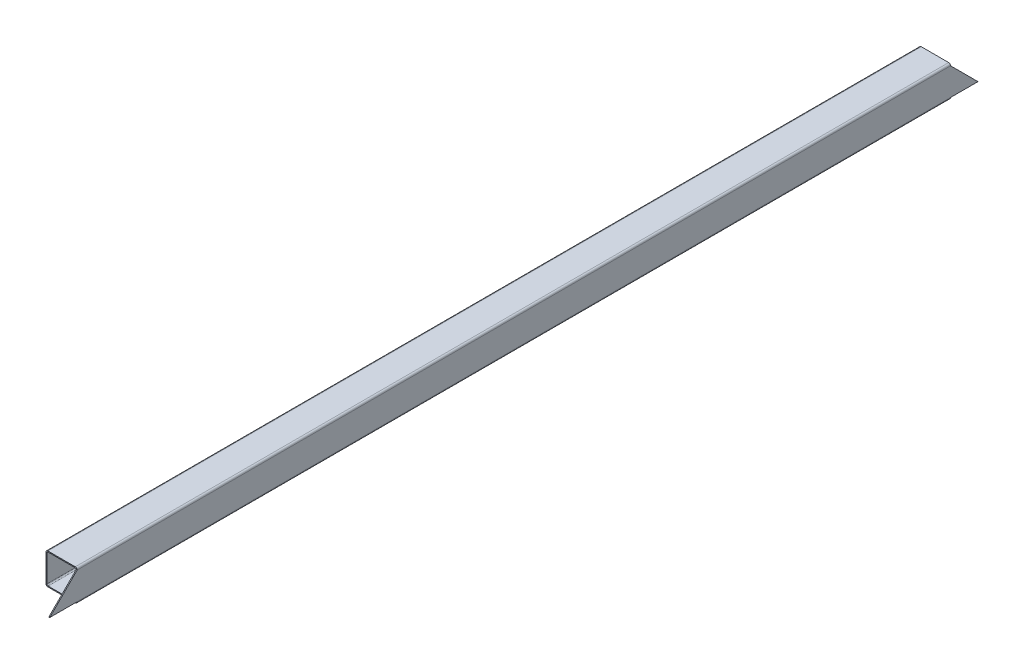
ISO-10303-21;
HEADER;
FILE_DESCRIPTION(('STEP AP214'),'2;1');
FILE_NAME('part.step','',(''),(''),'','','');
FILE_SCHEMA(('AUTOMOTIVE_DESIGN { 1 0 10303 214 1 1 1 1 }'));
ENDSEC;
DATA;
#1=APPLICATION_CONTEXT('core data for automotive mechanical design processes');
#2=APPLICATION_PROTOCOL_DEFINITION('international standard','automotive_design',2000,#1);
#3=PRODUCT_CONTEXT('',#1,'mechanical');
#4=PRODUCT('Part','Part','',(#3));
#5=PRODUCT_RELATED_PRODUCT_CATEGORY('part','',(#4));
#6=PRODUCT_DEFINITION_FORMATION('','',#4);
#7=PRODUCT_DEFINITION_CONTEXT('part definition',#1,'design');
#8=PRODUCT_DEFINITION('design','',#6,#7);
#9=PRODUCT_DEFINITION_SHAPE('','',#8);
#10=(LENGTH_UNIT() NAMED_UNIT(*) SI_UNIT(.MILLI.,.METRE.));
#11=(NAMED_UNIT(*) PLANE_ANGLE_UNIT() SI_UNIT($,.RADIAN.));
#12=(NAMED_UNIT(*) SI_UNIT($,.STERADIAN.) SOLID_ANGLE_UNIT());
#13=UNCERTAINTY_MEASURE_WITH_UNIT(LENGTH_MEASURE(1.E-05),#10,'distance_accuracy_value','');
#14=(GEOMETRIC_REPRESENTATION_CONTEXT(3) GLOBAL_UNCERTAINTY_ASSIGNED_CONTEXT((#13)) GLOBAL_UNIT_ASSIGNED_CONTEXT((#10,
#11,#12)) REPRESENTATION_CONTEXT('',''));
#15=CARTESIAN_POINT('',(0.,0.,0.));
#16=DIRECTION('',(0.,0.,1.));
#17=DIRECTION('',(1.,0.,0.));
#18=AXIS2_PLACEMENT_3D('',#15,#16,#17);
#19=CARTESIAN_POINT('',(-44.0000000000005,-43.9999999999965,-2800.));
#20=DIRECTION('',(0.,0.,1.));
#21=DIRECTION('',(1.,0.,0.));
#22=AXIS2_PLACEMENT_3D('',#19,#20,#21);
#23=PLANE('',#22);
#24=DIRECTION('',(0.,1.,0.));
#25=VECTOR('',#24,1.);
#26=CARTESIAN_POINT('',(46.9999999999991,-43.9999999999965,-2800.));
#27=LINE('',#26,#25);
#28=CARTESIAN_POINT('',(46.9999999999991,-43.9999999999965,-2800.));
#29=VERTEX_POINT('',#28);
#30=CARTESIAN_POINT('',(46.9999999999991,-42.9999999999966,-2800.));
#31=VERTEX_POINT('',#30);
#32=EDGE_CURVE('E47',#29,#31,#27,.T.);
#33=ORIENTED_EDGE('',*,*,#32,.F.);
#34=DIRECTION('',(1.,0.,0.));
#35=VECTOR('',#34,1.);
#36=CARTESIAN_POINT('',(-77.4507934888333,-43.9999999999965,-2800.));
#37=LINE('',#36,#35);
#38=CARTESIAN_POINT('',(49.9999999999989,-43.9999999999965,-2800.));
#39=VERTEX_POINT('',#38);
#40=EDGE_CURVE('E200',#29,#39,#37,.T.);
#41=ORIENTED_EDGE('',*,*,#40,.T.);
#42=CARTESIAN_POINT('',(43.9999999999987,-43.9999999999965,-2800.));
#43=DIRECTION('',(0.,0.,1.));
#44=DIRECTION('',(1.,0.,0.));
#45=AXIS2_PLACEMENT_3D('',#42,#43,#44);
#46=CIRCLE('',#45,6.00000000000014);
#47=CARTESIAN_POINT('',(43.9999999999987,-49.9999999999967,-2800.));
#48=VERTEX_POINT('',#47);
#49=EDGE_CURVE('E291',#48,#39,#46,.T.);
#50=ORIENTED_EDGE('',*,*,#49,.F.);
#51=DIRECTION('',(1.,0.,0.));
#52=VECTOR('',#51,1.);
#53=CARTESIAN_POINT('',(-44.0000000000005,-49.9999999999966,-2800.));
#54=LINE('',#53,#52);
#55=CARTESIAN_POINT('',(-44.0000000000005,-49.9999999999966,-2800.));
#56=VERTEX_POINT('',#55);
#57=EDGE_CURVE('E287',#56,#48,#54,.T.);
#58=ORIENTED_EDGE('',*,*,#57,.F.);
#59=CARTESIAN_POINT('',(-44.0000000000005,-43.9999999999965,-2800.));
#60=DIRECTION('',(0.,0.,1.));
#61=DIRECTION('',(1.,0.,0.));
#62=AXIS2_PLACEMENT_3D('',#59,#60,#61);
#63=CIRCLE('',#62,6.00000000000014);
#64=CARTESIAN_POINT('',(-50.0000000000007,-43.9999999999965,-2800.));
#65=VERTEX_POINT('',#64);
#66=EDGE_CURVE('E284',#65,#56,#63,.T.);
#67=ORIENTED_EDGE('',*,*,#66,.F.);
#68=DIRECTION('',(0.,-1.,0.));
#69=VECTOR('',#68,1.);
#70=CARTESIAN_POINT('',(-50.0000000000007,44.0000000000034,-2800.));
#71=LINE('',#70,#69);
#72=CARTESIAN_POINT('',(-50.0000000000007,44.0000000000034,-2800.));
#73=VERTEX_POINT('',#72);
#74=EDGE_CURVE('E302',#73,#65,#71,.T.);
#75=ORIENTED_EDGE('',*,*,#74,.F.);
#76=CARTESIAN_POINT('',(-44.0000000000005,44.0000000000034,-2800.));
#77=DIRECTION('',(0.,0.,1.));
#78=DIRECTION('',(1.,0.,0.));
#79=AXIS2_PLACEMENT_3D('',#76,#77,#78);
#80=CIRCLE('',#79,6.00000000000014);
#81=CARTESIAN_POINT('',(-44.0000000000005,50.0000000000036,-2800.));
#82=VERTEX_POINT('',#81);
#83=EDGE_CURVE('E299',#82,#73,#80,.T.);
#84=ORIENTED_EDGE('',*,*,#83,.F.);
#85=DIRECTION('',(-1.,0.,0.));
#86=VECTOR('',#85,1.);
#87=CARTESIAN_POINT('',(-44.0000000000005,50.0000000000035,-2800.));
#88=LINE('',#87,#86);
#89=CARTESIAN_POINT('',(43.9999999999987,50.0000000000035,-2800.));
#90=VERTEX_POINT('',#89);
#91=EDGE_CURVE('E296',#90,#82,#88,.T.);
#92=ORIENTED_EDGE('',*,*,#91,.F.);
#93=CARTESIAN_POINT('',(43.9999999999987,44.0000000000034,-2800.));
#94=DIRECTION('',(0.,0.,1.));
#95=DIRECTION('',(-1.,0.,0.));
#96=AXIS2_PLACEMENT_3D('',#93,#94,#95);
#97=CIRCLE('',#96,6.00000000000014);
#98=CARTESIAN_POINT('',(49.9999999999989,44.0000000000034,-2800.));
#99=VERTEX_POINT('',#98);
#100=EDGE_CURVE('E293',#99,#90,#97,.T.);
#101=ORIENTED_EDGE('',*,*,#100,.F.);
#102=DIRECTION('',(1.,0.,0.));
#103=VECTOR('',#102,1.);
#104=CARTESIAN_POINT('',(-77.4507934888333,44.0000000000034,-2800.));
#105=LINE('',#104,#103);
#106=CARTESIAN_POINT('',(46.9999999999991,44.0000000000034,-2800.));
#107=VERTEX_POINT('',#106);
#108=EDGE_CURVE('E60',#107,#99,#105,.T.);
#109=ORIENTED_EDGE('',*,*,#108,.F.);
#110=CARTESIAN_POINT('',(46.9999999999991,43.0000000000035,-2800.));
#111=VERTEX_POINT('',#110);
#112=EDGE_CURVE('E11',#111,#107,#27,.T.);
#113=ORIENTED_EDGE('',*,*,#112,.F.);
#114=CARTESIAN_POINT('',(42.9999999999991,43.0000000000035,-2800.));
#115=DIRECTION('',(0.,0.,1.));
#116=DIRECTION('',(-1.,0.,0.));
#117=AXIS2_PLACEMENT_3D('',#114,#115,#116);
#118=CIRCLE('',#117,4.);
#119=CARTESIAN_POINT('',(42.9999999999991,47.0000000000035,-2800.));
#120=VERTEX_POINT('',#119);
#121=EDGE_CURVE('E235',#111,#120,#118,.T.);
#122=ORIENTED_EDGE('',*,*,#121,.T.);
#123=DIRECTION('',(-1.,0.,0.));
#124=VECTOR('',#123,1.);
#125=CARTESIAN_POINT('',(-43.0000000000009,47.0000000000035,-2800.));
#126=LINE('',#125,#124);
#127=CARTESIAN_POINT('',(-43.0000000000009,47.0000000000035,-2800.));
#128=VERTEX_POINT('',#127);
#129=EDGE_CURVE('E238',#120,#128,#126,.T.);
#130=ORIENTED_EDGE('',*,*,#129,.T.);
#131=CARTESIAN_POINT('',(-43.0000000000009,43.0000000000035,-2800.));
#132=DIRECTION('',(0.,0.,1.));
#133=DIRECTION('',(1.,0.,0.));
#134=AXIS2_PLACEMENT_3D('',#131,#132,#133);
#135=CIRCLE('',#134,4.);
#136=CARTESIAN_POINT('',(-47.0000000000009,43.0000000000035,-2800.));
#137=VERTEX_POINT('',#136);
#138=EDGE_CURVE('E241',#128,#137,#135,.T.);
#139=ORIENTED_EDGE('',*,*,#138,.T.);
#140=DIRECTION('',(0.,-1.,0.));
#141=VECTOR('',#140,1.);
#142=CARTESIAN_POINT('',(-47.0000000000009,43.0000000000035,-2800.));
#143=LINE('',#142,#141);
#144=CARTESIAN_POINT('',(-47.0000000000009,-42.9999999999966,-2800.));
#145=VERTEX_POINT('',#144);
#146=EDGE_CURVE('E244',#137,#145,#143,.T.);
#147=ORIENTED_EDGE('',*,*,#146,.T.);
#148=CARTESIAN_POINT('',(-43.0000000000009,-42.9999999999966,-2800.));
#149=DIRECTION('',(0.,0.,1.));
#150=DIRECTION('',(1.,0.,0.));
#151=AXIS2_PLACEMENT_3D('',#148,#149,#150);
#152=CIRCLE('',#151,4.);
#153=CARTESIAN_POINT('',(-43.0000000000009,-46.9999999999966,-2800.));
#154=VERTEX_POINT('',#153);
#155=EDGE_CURVE('E226',#145,#154,#152,.T.);
#156=ORIENTED_EDGE('',*,*,#155,.T.);
#157=DIRECTION('',(1.,0.,0.));
#158=VECTOR('',#157,1.);
#159=CARTESIAN_POINT('',(-43.0000000000009,-46.9999999999966,-2800.));
#160=LINE('',#159,#158);
#161=CARTESIAN_POINT('',(42.9999999999991,-46.9999999999966,-2800.));
#162=VERTEX_POINT('',#161);
#163=EDGE_CURVE('E229',#154,#162,#160,.T.);
#164=ORIENTED_EDGE('',*,*,#163,.T.);
#165=CARTESIAN_POINT('',(42.9999999999991,-42.9999999999966,-2800.));
#166=DIRECTION('',(0.,0.,1.));
#167=DIRECTION('',(1.,0.,0.));
#168=AXIS2_PLACEMENT_3D('',#165,#166,#167);
#169=CIRCLE('',#168,4.);
#170=EDGE_CURVE('E233',#162,#31,#169,.T.);
#171=ORIENTED_EDGE('',*,*,#170,.T.);
#172=EDGE_LOOP('',(#33,#41,#50,#58,#67,#75,#84,#92,#101,#109,#113,#122,#130,#139,#147,#156,#164,#171));
#173=FACE_BOUND('',#172,.T.);
#174=ADVANCED_FACE('F36',(#173),#23,.F.);
#175=CARTESIAN_POINT('',(-44.0000000000005,-43.9999999999965,-2800.));
#176=DIRECTION('',(0.,0.,1.));
#177=DIRECTION('',(1.,0.,0.));
#178=AXIS2_PLACEMENT_3D('',#175,#176,#177);
#179=CYLINDRICAL_SURFACE('',#178,6.00000000000014);
#180=CARTESIAN_POINT('',(-44.0000000000005,-43.9999999999965,0.));
#181=DIRECTION('',(0.,0.,1.));
#182=DIRECTION('',(1.,0.,0.));
#183=AXIS2_PLACEMENT_3D('',#180,#181,#182);
#184=CIRCLE('',#183,6.00000000000014);
#185=CARTESIAN_POINT('',(-50.0000000000007,-43.9999999999965,0.));
#186=VERTEX_POINT('',#185);
#187=CARTESIAN_POINT('',(-44.0000000000005,-49.9999999999966,0.));
#188=VERTEX_POINT('',#187);
#189=EDGE_CURVE('E268',#186,#188,#184,.T.);
#190=ORIENTED_EDGE('',*,*,#189,.F.);
#191=DIRECTION('',(0.,0.,1.));
#192=VECTOR('',#191,1.);
#193=CARTESIAN_POINT('',(-50.0000000000007,-43.9999999999965,-2800.));
#194=LINE('',#193,#192);
#195=EDGE_CURVE('E323',#65,#186,#194,.T.);
#196=ORIENTED_EDGE('',*,*,#195,.F.);
#197=ORIENTED_EDGE('',*,*,#66,.T.);
#198=DIRECTION('',(0.,0.,1.));
#199=VECTOR('',#198,1.);
#200=CARTESIAN_POINT('',(-44.0000000000005,-49.9999999999966,-2800.));
#201=LINE('',#200,#199);
#202=EDGE_CURVE('E40',#56,#188,#201,.T.);
#203=ORIENTED_EDGE('',*,*,#202,.T.);
#204=EDGE_LOOP('',(#190,#196,#197,#203));
#205=FACE_BOUND('',#204,.T.);
#206=ADVANCED_FACE('F38',(#205),#179,.T.);
#207=CARTESIAN_POINT('',(-50.0000000000007,44.0000000000034,-2800.));
#208=DIRECTION('',(-1.,0.,0.));
#209=DIRECTION('',(0.,0.,1.));
#210=AXIS2_PLACEMENT_3D('',#207,#208,#209);
#211=PLANE('',#210);
#212=DIRECTION('',(0.,-1.,0.));
#213=VECTOR('',#212,1.);
#214=CARTESIAN_POINT('',(-50.0000000000007,44.0000000000034,0.));
#215=LINE('',#214,#213);
#216=CARTESIAN_POINT('',(-50.0000000000007,44.0000000000034,0.));
#217=VERTEX_POINT('',#216);
#218=EDGE_CURVE('E288',#217,#186,#215,.T.);
#219=ORIENTED_EDGE('',*,*,#218,.F.);
#220=DIRECTION('',(0.,0.,1.));
#221=VECTOR('',#220,1.);
#222=CARTESIAN_POINT('',(-50.0000000000007,44.0000000000034,-2800.));
#223=LINE('',#222,#221);
#224=EDGE_CURVE('E325',#73,#217,#223,.T.);
#225=ORIENTED_EDGE('',*,*,#224,.F.);
#226=ORIENTED_EDGE('',*,*,#74,.T.);
#227=ORIENTED_EDGE('',*,*,#195,.T.);
#228=EDGE_LOOP('',(#219,#225,#226,#227));
#229=FACE_BOUND('',#228,.T.);
#230=ADVANCED_FACE('F347',(#229),#211,.T.);
#231=CARTESIAN_POINT('',(-44.0000000000005,44.0000000000034,-2800.));
#232=DIRECTION('',(0.,0.,1.));
#233=DIRECTION('',(1.,0.,0.));
#234=AXIS2_PLACEMENT_3D('',#231,#232,#233);
#235=CYLINDRICAL_SURFACE('',#234,6.00000000000014);
#236=CARTESIAN_POINT('',(-44.0000000000005,44.0000000000034,0.));
#237=DIRECTION('',(0.,0.,1.));
#238=DIRECTION('',(1.,0.,0.));
#239=AXIS2_PLACEMENT_3D('',#236,#237,#238);
#240=CIRCLE('',#239,6.00000000000014);
#241=CARTESIAN_POINT('',(-44.0000000000005,50.0000000000036,0.));
#242=VERTEX_POINT('',#241);
#243=EDGE_CURVE('E318',#242,#217,#240,.T.);
#244=ORIENTED_EDGE('',*,*,#243,.F.);
#245=DIRECTION('',(0.,0.,1.));
#246=VECTOR('',#245,1.);
#247=CARTESIAN_POINT('',(-44.0000000000005,50.0000000000036,-2800.));
#248=LINE('',#247,#246);
#249=EDGE_CURVE('E327',#82,#242,#248,.T.);
#250=ORIENTED_EDGE('',*,*,#249,.F.);
#251=ORIENTED_EDGE('',*,*,#83,.T.);
#252=ORIENTED_EDGE('',*,*,#224,.T.);
#253=EDGE_LOOP('',(#244,#250,#251,#252));
#254=FACE_BOUND('',#253,.T.);
#255=ADVANCED_FACE('F414',(#254),#235,.T.);
#256=CARTESIAN_POINT('',(-44.0000000000005,50.0000000000035,-2800.));
#257=DIRECTION('',(0.,1.,0.));
#258=DIRECTION('',(0.,0.,1.));
#259=AXIS2_PLACEMENT_3D('',#256,#257,#258);
#260=PLANE('',#259);
#261=DIRECTION('',(-1.,0.,0.));
#262=VECTOR('',#261,1.);
#263=CARTESIAN_POINT('',(-44.0000000000005,50.0000000000035,0.));
#264=LINE('',#263,#262);
#265=CARTESIAN_POINT('',(43.9999999999987,50.0000000000035,0.));
#266=VERTEX_POINT('',#265);
#267=EDGE_CURVE('E315',#266,#242,#264,.T.);
#268=ORIENTED_EDGE('',*,*,#267,.F.);
#269=DIRECTION('',(0.,0.,1.));
#270=VECTOR('',#269,1.);
#271=CARTESIAN_POINT('',(43.9999999999987,50.0000000000035,-2800.));
#272=LINE('',#271,#270);
#273=EDGE_CURVE('E329',#90,#266,#272,.T.);
#274=ORIENTED_EDGE('',*,*,#273,.F.);
#275=ORIENTED_EDGE('',*,*,#91,.T.);
#276=ORIENTED_EDGE('',*,*,#249,.T.);
#277=EDGE_LOOP('',(#268,#274,#275,#276));
#278=FACE_BOUND('',#277,.T.);
#279=ADVANCED_FACE('F417',(#278),#260,.T.);
#280=CARTESIAN_POINT('',(43.9999999999987,44.0000000000034,-2800.));
#281=DIRECTION('',(0.,0.,1.));
#282=DIRECTION('',(1.,0.,0.));
#283=AXIS2_PLACEMENT_3D('',#280,#281,#282);
#284=CYLINDRICAL_SURFACE('',#283,6.00000000000014);
#285=CARTESIAN_POINT('',(43.9999999999987,44.0000000000034,0.));
#286=DIRECTION('',(0.,0.,1.));
#287=DIRECTION('',(-1.,0.,0.));
#288=AXIS2_PLACEMENT_3D('',#285,#286,#287);
#289=CIRCLE('',#288,6.00000000000014);
#290=CARTESIAN_POINT('',(49.9999999999988,44.0000000000034,0.));
#291=VERTEX_POINT('',#290);
#292=EDGE_CURVE('E312',#291,#266,#289,.T.);
#293=ORIENTED_EDGE('',*,*,#292,.F.);
#294=DIRECTION('',(0.,0.,1.));
#295=VECTOR('',#294,1.);
#296=CARTESIAN_POINT('',(49.9999999999988,44.0000000000034,-2800.));
#297=LINE('',#296,#295);
#298=EDGE_CURVE('E331',#99,#291,#297,.T.);
#299=ORIENTED_EDGE('',*,*,#298,.F.);
#300=ORIENTED_EDGE('',*,*,#100,.T.);
#301=ORIENTED_EDGE('',*,*,#273,.T.);
#302=EDGE_LOOP('',(#293,#299,#300,#301));
#303=FACE_BOUND('',#302,.T.);
#304=ADVANCED_FACE('F421',(#303),#284,.T.);
#305=CARTESIAN_POINT('',(49.9999999999989,44.0000000000034,-2800.));
#306=DIRECTION('',(1.,0.,0.));
#307=DIRECTION('',(0.,0.,-1.));
#308=AXIS2_PLACEMENT_3D('',#305,#306,#307);
#309=PLANE('',#308);
#310=ORIENTED_EDGE('',*,*,#298,.T.);
#311=DIRECTION('',(0.,-0.707106781186548,0.707106781186547));
#312=VECTOR('',#311,1.);
#313=CARTESIAN_POINT('',(49.9999999999989,-43.9999999999966,88.));
#314=LINE('',#313,#312);
#315=CARTESIAN_POINT('',(49.9999999999989,-43.9999999999966,88.));
#316=VERTEX_POINT('',#315);
#317=EDGE_CURVE('E214',#291,#316,#314,.T.);
#318=ORIENTED_EDGE('',*,*,#317,.T.);
#319=DIRECTION('',(0.,0.,-1.));
#320=VECTOR('',#319,1.);
#321=CARTESIAN_POINT('',(49.9999999999989,-43.9999999999965,0.));
#322=LINE('',#321,#320);
#323=CARTESIAN_POINT('',(49.9999999999989,-43.9999999999965,0.));
#324=VERTEX_POINT('',#323);
#325=EDGE_CURVE('E205',#316,#324,#322,.T.);
#326=ORIENTED_EDGE('',*,*,#325,.T.);
#327=DIRECTION('',(0.,0.,1.));
#328=VECTOR('',#327,1.);
#329=CARTESIAN_POINT('',(49.9999999999989,-43.9999999999965,-2800.));
#330=LINE('',#329,#328);
#331=EDGE_CURVE('E195',#39,#324,#330,.T.);
#332=ORIENTED_EDGE('',*,*,#331,.F.);
#333=DIRECTION('',(0.,0.,-1.));
#334=VECTOR('',#333,1.);
#335=CARTESIAN_POINT('',(49.9999999999989,-43.9999999999965,-2800.));
#336=LINE('',#335,#334);
#337=CARTESIAN_POINT('',(49.9999999999989,-43.9999999999965,-2888.));
#338=VERTEX_POINT('',#337);
#339=EDGE_CURVE('E180',#39,#338,#336,.T.);
#340=ORIENTED_EDGE('',*,*,#339,.T.);
#341=DIRECTION('',(0.,0.707106781186547,0.707106781186548));
#342=VECTOR('',#341,1.);
#343=CARTESIAN_POINT('',(49.9999999999989,-43.9999999999965,-2888.));
#344=LINE('',#343,#342);
#345=EDGE_CURVE('E184',#338,#99,#344,.T.);
#346=ORIENTED_EDGE('',*,*,#345,.T.);
#347=EDGE_LOOP('',(#310,#318,#326,#332,#340,#346));
#348=FACE_BOUND('',#347,.T.);
#349=ADVANCED_FACE('F192',(#348),#309,.T.);
#350=CARTESIAN_POINT('',(43.9999999999987,-43.9999999999965,-2800.));
#351=DIRECTION('',(0.,0.,1.));
#352=DIRECTION('',(1.,0.,0.));
#353=AXIS2_PLACEMENT_3D('',#350,#351,#352);
#354=CYLINDRICAL_SURFACE('',#353,6.00000000000014);
#355=CARTESIAN_POINT('',(43.9999999999987,-43.9999999999965,0.));
#356=DIRECTION('',(0.,0.,1.));
#357=DIRECTION('',(1.,0.,0.));
#358=AXIS2_PLACEMENT_3D('',#355,#356,#357);
#359=CIRCLE('',#358,6.00000000000014);
#360=CARTESIAN_POINT('',(43.9999999999987,-49.9999999999967,0.));
#361=VERTEX_POINT('',#360);
#362=EDGE_CURVE('E310',#361,#324,#359,.T.);
#363=ORIENTED_EDGE('',*,*,#362,.F.);
#364=DIRECTION('',(0.,0.,1.));
#365=VECTOR('',#364,1.);
#366=CARTESIAN_POINT('',(43.9999999999987,-49.9999999999967,-2800.));
#367=LINE('',#366,#365);
#368=EDGE_CURVE('E333',#48,#361,#367,.T.);
#369=ORIENTED_EDGE('',*,*,#368,.F.);
#370=ORIENTED_EDGE('',*,*,#49,.T.);
#371=ORIENTED_EDGE('',*,*,#331,.T.);
#372=EDGE_LOOP('',(#363,#369,#370,#371));
#373=FACE_BOUND('',#372,.T.);
#374=ADVANCED_FACE('F352',(#373),#354,.T.);
#375=CARTESIAN_POINT('',(-44.0000000000005,-49.9999999999966,-2800.));
#376=DIRECTION('',(0.,-1.,0.));
#377=DIRECTION('',(0.,0.,-1.));
#378=AXIS2_PLACEMENT_3D('',#375,#376,#377);
#379=PLANE('',#378);
#380=DIRECTION('',(1.,0.,0.));
#381=VECTOR('',#380,1.);
#382=CARTESIAN_POINT('',(-44.0000000000005,-49.9999999999966,0.));
#383=LINE('',#382,#381);
#384=EDGE_CURVE('E307',#188,#361,#383,.T.);
#385=ORIENTED_EDGE('',*,*,#384,.F.);
#386=ORIENTED_EDGE('',*,*,#202,.F.);
#387=ORIENTED_EDGE('',*,*,#57,.T.);
#388=ORIENTED_EDGE('',*,*,#368,.T.);
#389=EDGE_LOOP('',(#385,#386,#387,#388));
#390=FACE_BOUND('',#389,.T.);
#391=ADVANCED_FACE('F341',(#390),#379,.T.);
#392=CARTESIAN_POINT('',(-44.0000000000005,-43.9999999999965,0.));
#393=DIRECTION('',(0.,0.,1.));
#394=DIRECTION('',(1.,0.,0.));
#395=AXIS2_PLACEMENT_3D('',#392,#393,#394);
#396=PLANE('',#395);
#397=DIRECTION('',(0.,-1.,0.));
#398=VECTOR('',#397,1.);
#399=CARTESIAN_POINT('',(46.9999999999991,-43.9999999999965,0.));
#400=LINE('',#399,#398);
#401=CARTESIAN_POINT('',(46.9999999999991,44.0000000000034,0.));
#402=VERTEX_POINT('',#401);
#403=CARTESIAN_POINT('',(46.9999999999991,43.0000000000035,0.));
#404=VERTEX_POINT('',#403);
#405=EDGE_CURVE('E212',#402,#404,#400,.T.);
#406=ORIENTED_EDGE('',*,*,#405,.F.);
#407=DIRECTION('',(1.,0.,0.));
#408=VECTOR('',#407,1.);
#409=CARTESIAN_POINT('',(-77.4507934888333,44.0000000000034,0.));
#410=LINE('',#409,#408);
#411=EDGE_CURVE('E219',#402,#291,#410,.T.);
#412=ORIENTED_EDGE('',*,*,#411,.T.);
#413=ORIENTED_EDGE('',*,*,#292,.T.);
#414=ORIENTED_EDGE('',*,*,#267,.T.);
#415=ORIENTED_EDGE('',*,*,#243,.T.);
#416=ORIENTED_EDGE('',*,*,#218,.T.);
#417=ORIENTED_EDGE('',*,*,#189,.T.);
#418=ORIENTED_EDGE('',*,*,#384,.T.);
#419=ORIENTED_EDGE('',*,*,#362,.T.);
#420=DIRECTION('',(1.,0.,0.));
#421=VECTOR('',#420,1.);
#422=CARTESIAN_POINT('',(-77.4507934888333,-43.9999999999965,0.));
#423=LINE('',#422,#421);
#424=CARTESIAN_POINT('',(46.9999999999991,-43.9999999999965,0.));
#425=VERTEX_POINT('',#424);
#426=EDGE_CURVE('E217',#425,#324,#423,.T.);
#427=ORIENTED_EDGE('',*,*,#426,.F.);
#428=CARTESIAN_POINT('',(46.9999999999991,-42.9999999999966,0.));
#429=VERTEX_POINT('',#428);
#430=EDGE_CURVE('E45',#429,#425,#400,.T.);
#431=ORIENTED_EDGE('',*,*,#430,.F.);
#432=CARTESIAN_POINT('',(42.9999999999991,-42.9999999999966,0.));
#433=DIRECTION('',(0.,0.,1.));
#434=DIRECTION('',(1.,0.,0.));
#435=AXIS2_PLACEMENT_3D('',#432,#433,#434);
#436=CIRCLE('',#435,4.);
#437=CARTESIAN_POINT('',(42.9999999999991,-46.9999999999966,0.));
#438=VERTEX_POINT('',#437);
#439=EDGE_CURVE('E252',#438,#429,#436,.T.);
#440=ORIENTED_EDGE('',*,*,#439,.F.);
#441=DIRECTION('',(1.,0.,0.));
#442=VECTOR('',#441,1.);
#443=CARTESIAN_POINT('',(-43.0000000000009,-46.9999999999966,0.));
#444=LINE('',#443,#442);
#445=CARTESIAN_POINT('',(-43.0000000000009,-46.9999999999966,0.));
#446=VERTEX_POINT('',#445);
#447=EDGE_CURVE('E249',#446,#438,#444,.T.);
#448=ORIENTED_EDGE('',*,*,#447,.F.);
#449=CARTESIAN_POINT('',(-43.0000000000009,-42.9999999999966,0.));
#450=DIRECTION('',(0.,0.,1.));
#451=DIRECTION('',(1.,0.,0.));
#452=AXIS2_PLACEMENT_3D('',#449,#450,#451);
#453=CIRCLE('',#452,4.);
#454=CARTESIAN_POINT('',(-47.0000000000009,-42.9999999999966,0.));
#455=VERTEX_POINT('',#454);
#456=EDGE_CURVE('E225',#455,#446,#453,.T.);
#457=ORIENTED_EDGE('',*,*,#456,.F.);
#458=DIRECTION('',(0.,-1.,0.));
#459=VECTOR('',#458,1.);
#460=CARTESIAN_POINT('',(-47.0000000000009,43.0000000000035,0.));
#461=LINE('',#460,#459);
#462=CARTESIAN_POINT('',(-47.0000000000009,43.0000000000035,0.));
#463=VERTEX_POINT('',#462);
#464=EDGE_CURVE('E230',#463,#455,#461,.T.);
#465=ORIENTED_EDGE('',*,*,#464,.F.);
#466=CARTESIAN_POINT('',(-43.0000000000009,43.0000000000035,0.));
#467=DIRECTION('',(0.,0.,1.));
#468=DIRECTION('',(1.,0.,0.));
#469=AXIS2_PLACEMENT_3D('',#466,#467,#468);
#470=CIRCLE('',#469,4.);
#471=CARTESIAN_POINT('',(-43.0000000000009,47.0000000000035,0.));
#472=VERTEX_POINT('',#471);
#473=EDGE_CURVE('E261',#472,#463,#470,.T.);
#474=ORIENTED_EDGE('',*,*,#473,.F.);
#475=DIRECTION('',(-1.,0.,0.));
#476=VECTOR('',#475,1.);
#477=CARTESIAN_POINT('',(-43.0000000000009,47.0000000000035,0.));
#478=LINE('',#477,#476);
#479=CARTESIAN_POINT('',(42.9999999999991,47.0000000000035,0.));
#480=VERTEX_POINT('',#479);
#481=EDGE_CURVE('E258',#480,#472,#478,.T.);
#482=ORIENTED_EDGE('',*,*,#481,.F.);
#483=CARTESIAN_POINT('',(42.9999999999991,43.0000000000035,0.));
#484=DIRECTION('',(0.,0.,1.));
#485=DIRECTION('',(-1.,0.,0.));
#486=AXIS2_PLACEMENT_3D('',#483,#484,#485);
#487=CIRCLE('',#486,4.);
#488=EDGE_CURVE('E255',#404,#480,#487,.T.);
#489=ORIENTED_EDGE('',*,*,#488,.F.);
#490=EDGE_LOOP('',(#406,#412,#413,#414,#415,#416,#417,#418,#419,#427,#431,#440,#448,#457,#465,
#474,#482,#489));
#491=FACE_BOUND('',#490,.T.);
#492=ADVANCED_FACE('F343',(#491),#396,.T.);
#493=CARTESIAN_POINT('',(-43.0000000000009,-42.9999999999966,-2800.));
#494=DIRECTION('',(0.,0.,1.));
#495=DIRECTION('',(1.,0.,0.));
#496=AXIS2_PLACEMENT_3D('',#493,#494,#495);
#497=CYLINDRICAL_SURFACE('',#496,4.);
#498=ORIENTED_EDGE('',*,*,#456,.T.);
#499=DIRECTION('',(0.,0.,1.));
#500=VECTOR('',#499,1.);
#501=CARTESIAN_POINT('',(-43.0000000000009,-46.9999999999966,-2800.));
#502=LINE('',#501,#500);
#503=EDGE_CURVE('E247',#154,#446,#502,.T.);
#504=ORIENTED_EDGE('',*,*,#503,.F.);
#505=ORIENTED_EDGE('',*,*,#155,.F.);
#506=DIRECTION('',(0.,0.,1.));
#507=VECTOR('',#506,1.);
#508=CARTESIAN_POINT('',(-47.0000000000009,-42.9999999999966,-2800.));
#509=LINE('',#508,#507);
#510=EDGE_CURVE('E266',#145,#455,#509,.T.);
#511=ORIENTED_EDGE('',*,*,#510,.T.);
#512=EDGE_LOOP('',(#498,#504,#505,#511));
#513=FACE_BOUND('',#512,.T.);
#514=ADVANCED_FACE('F387',(#513),#497,.F.);
#515=CARTESIAN_POINT('',(-47.0000000000009,43.0000000000035,-2800.));
#516=DIRECTION('',(-1.,0.,0.));
#517=DIRECTION('',(0.,0.,1.));
#518=AXIS2_PLACEMENT_3D('',#515,#516,#517);
#519=PLANE('',#518);
#520=ORIENTED_EDGE('',*,*,#464,.T.);
#521=ORIENTED_EDGE('',*,*,#510,.F.);
#522=ORIENTED_EDGE('',*,*,#146,.F.);
#523=DIRECTION('',(0.,0.,1.));
#524=VECTOR('',#523,1.);
#525=CARTESIAN_POINT('',(-47.0000000000009,43.0000000000035,-2800.));
#526=LINE('',#525,#524);
#527=EDGE_CURVE('E269',#137,#463,#526,.T.);
#528=ORIENTED_EDGE('',*,*,#527,.T.);
#529=EDGE_LOOP('',(#520,#521,#522,#528));
#530=FACE_BOUND('',#529,.T.);
#531=ADVANCED_FACE('F383',(#530),#519,.F.);
#532=CARTESIAN_POINT('',(-43.0000000000009,43.0000000000035,-2800.));
#533=DIRECTION('',(0.,0.,1.));
#534=DIRECTION('',(1.,0.,0.));
#535=AXIS2_PLACEMENT_3D('',#532,#533,#534);
#536=CYLINDRICAL_SURFACE('',#535,4.);
#537=ORIENTED_EDGE('',*,*,#473,.T.);
#538=ORIENTED_EDGE('',*,*,#527,.F.);
#539=ORIENTED_EDGE('',*,*,#138,.F.);
#540=DIRECTION('',(0.,0.,1.));
#541=VECTOR('',#540,1.);
#542=CARTESIAN_POINT('',(-43.0000000000009,47.0000000000035,-2800.));
#543=LINE('',#542,#541);
#544=EDGE_CURVE('E271',#128,#472,#543,.T.);
#545=ORIENTED_EDGE('',*,*,#544,.T.);
#546=EDGE_LOOP('',(#537,#538,#539,#545));
#547=FACE_BOUND('',#546,.T.);
#548=ADVANCED_FACE('F379',(#547),#536,.F.);
#549=CARTESIAN_POINT('',(-43.0000000000009,47.0000000000035,-2800.));
#550=DIRECTION('',(0.,1.,0.));
#551=DIRECTION('',(0.,0.,1.));
#552=AXIS2_PLACEMENT_3D('',#549,#550,#551);
#553=PLANE('',#552);
#554=ORIENTED_EDGE('',*,*,#481,.T.);
#555=ORIENTED_EDGE('',*,*,#544,.F.);
#556=ORIENTED_EDGE('',*,*,#129,.F.);
#557=DIRECTION('',(0.,0.,1.));
#558=VECTOR('',#557,1.);
#559=CARTESIAN_POINT('',(42.9999999999991,47.0000000000035,-2800.));
#560=LINE('',#559,#558);
#561=EDGE_CURVE('E273',#120,#480,#560,.T.);
#562=ORIENTED_EDGE('',*,*,#561,.T.);
#563=EDGE_LOOP('',(#554,#555,#556,#562));
#564=FACE_BOUND('',#563,.T.);
#565=ADVANCED_FACE('F377',(#564),#553,.F.);
#566=CARTESIAN_POINT('',(42.9999999999991,43.0000000000035,-2800.));
#567=DIRECTION('',(0.,0.,1.));
#568=DIRECTION('',(1.,0.,0.));
#569=AXIS2_PLACEMENT_3D('',#566,#567,#568);
#570=CYLINDRICAL_SURFACE('',#569,4.);
#571=ORIENTED_EDGE('',*,*,#488,.T.);
#572=ORIENTED_EDGE('',*,*,#561,.F.);
#573=ORIENTED_EDGE('',*,*,#121,.F.);
#574=DIRECTION('',(0.,0.,1.));
#575=VECTOR('',#574,1.);
#576=CARTESIAN_POINT('',(46.9999999999991,43.0000000000035,-2800.));
#577=LINE('',#576,#575);
#578=EDGE_CURVE('E275',#111,#404,#577,.T.);
#579=ORIENTED_EDGE('',*,*,#578,.T.);
#580=EDGE_LOOP('',(#571,#572,#573,#579));
#581=FACE_BOUND('',#580,.T.);
#582=ADVANCED_FACE('F373',(#581),#570,.F.);
#583=CARTESIAN_POINT('',(46.9999999999991,43.0000000000035,-2800.));
#584=DIRECTION('',(1.,0.,0.));
#585=DIRECTION('',(0.,0.,-1.));
#586=AXIS2_PLACEMENT_3D('',#583,#584,#585);
#587=PLANE('',#586);
#588=DIRECTION('',(0.,0.,1.));
#589=VECTOR('',#588,1.);
#590=CARTESIAN_POINT('',(46.9999999999991,-42.9999999999966,-2800.));
#591=LINE('',#590,#589);
#592=EDGE_CURVE('E277',#31,#429,#591,.T.);
#593=ORIENTED_EDGE('',*,*,#592,.T.);
#594=ORIENTED_EDGE('',*,*,#430,.T.);
#595=DIRECTION('',(0.,0.,1.));
#596=VECTOR('',#595,1.);
#597=CARTESIAN_POINT('',(46.9999999999991,-43.9999999999965,0.));
#598=LINE('',#597,#596);
#599=CARTESIAN_POINT('',(46.9999999999991,-43.9999999999966,88.));
#600=VERTEX_POINT('',#599);
#601=EDGE_CURVE('E209',#425,#600,#598,.T.);
#602=ORIENTED_EDGE('',*,*,#601,.T.);
#603=DIRECTION('',(0.,0.707106781186548,-0.707106781186547));
#604=VECTOR('',#603,1.);
#605=CARTESIAN_POINT('',(46.9999999999991,-43.9999999999966,88.));
#606=LINE('',#605,#604);
#607=EDGE_CURVE('E206',#600,#402,#606,.T.);
#608=ORIENTED_EDGE('',*,*,#607,.T.);
#609=ORIENTED_EDGE('',*,*,#405,.T.);
#610=ORIENTED_EDGE('',*,*,#578,.F.);
#611=ORIENTED_EDGE('',*,*,#112,.T.);
#612=DIRECTION('',(0.,-0.707106781186547,-0.707106781186548));
#613=VECTOR('',#612,1.);
#614=CARTESIAN_POINT('',(46.9999999999991,-43.9999999999965,-2888.));
#615=LINE('',#614,#613);
#616=CARTESIAN_POINT('',(46.9999999999991,-43.9999999999965,-2888.));
#617=VERTEX_POINT('',#616);
#618=EDGE_CURVE('E203',#107,#617,#615,.T.);
#619=ORIENTED_EDGE('',*,*,#618,.T.);
#620=DIRECTION('',(0.,0.,1.));
#621=VECTOR('',#620,1.);
#622=CARTESIAN_POINT('',(46.9999999999991,-43.9999999999965,-2800.));
#623=LINE('',#622,#621);
#624=EDGE_CURVE('E181',#617,#29,#623,.T.);
#625=ORIENTED_EDGE('',*,*,#624,.T.);
#626=ORIENTED_EDGE('',*,*,#32,.T.);
#627=EDGE_LOOP('',(#593,#594,#602,#608,#609,#610,#611,#619,#625,#626));
#628=FACE_BOUND('',#627,.T.);
#629=ADVANCED_FACE('F359',(#628),#587,.F.);
#630=CARTESIAN_POINT('',(42.9999999999991,-42.9999999999966,-2800.));
#631=DIRECTION('',(0.,0.,1.));
#632=DIRECTION('',(1.,0.,0.));
#633=AXIS2_PLACEMENT_3D('',#630,#631,#632);
#634=CYLINDRICAL_SURFACE('',#633,4.);
#635=ORIENTED_EDGE('',*,*,#439,.T.);
#636=ORIENTED_EDGE('',*,*,#592,.F.);
#637=ORIENTED_EDGE('',*,*,#170,.F.);
#638=DIRECTION('',(0.,0.,1.));
#639=VECTOR('',#638,1.);
#640=CARTESIAN_POINT('',(42.9999999999991,-46.9999999999966,-2800.));
#641=LINE('',#640,#639);
#642=EDGE_CURVE('E280',#162,#438,#641,.T.);
#643=ORIENTED_EDGE('',*,*,#642,.T.);
#644=EDGE_LOOP('',(#635,#636,#637,#643));
#645=FACE_BOUND('',#644,.T.);
#646=ADVANCED_FACE('F394',(#645),#634,.F.);
#647=CARTESIAN_POINT('',(-43.0000000000009,-46.9999999999966,-2800.));
#648=DIRECTION('',(0.,-1.,0.));
#649=DIRECTION('',(0.,0.,-1.));
#650=AXIS2_PLACEMENT_3D('',#647,#648,#649);
#651=PLANE('',#650);
#652=ORIENTED_EDGE('',*,*,#447,.T.);
#653=ORIENTED_EDGE('',*,*,#642,.F.);
#654=ORIENTED_EDGE('',*,*,#163,.F.);
#655=ORIENTED_EDGE('',*,*,#503,.T.);
#656=EDGE_LOOP('',(#652,#653,#654,#655));
#657=FACE_BOUND('',#656,.T.);
#658=ADVANCED_FACE('F392',(#657),#651,.F.);
#659=CARTESIAN_POINT('',(-77.4507934888333,-43.9999999999965,0.));
#660=DIRECTION('',(0.,-1.,0.));
#661=DIRECTION('',(0.,0.,-1.));
#662=AXIS2_PLACEMENT_3D('',#659,#660,#661);
#663=PLANE('',#662);
#664=ORIENTED_EDGE('',*,*,#601,.F.);
#665=ORIENTED_EDGE('',*,*,#426,.T.);
#666=ORIENTED_EDGE('',*,*,#325,.F.);
#667=DIRECTION('',(1.,0.,0.));
#668=VECTOR('',#667,1.);
#669=CARTESIAN_POINT('',(-77.4507934888333,-43.9999999999966,88.));
#670=LINE('',#669,#668);
#671=EDGE_CURVE('E210',#600,#316,#670,.T.);
#672=ORIENTED_EDGE('',*,*,#671,.F.);
#673=EDGE_LOOP('',(#664,#665,#666,#672));
#674=FACE_BOUND('',#673,.T.);
#675=ADVANCED_FACE('F362',(#674),#663,.T.);
#676=CARTESIAN_POINT('',(-77.4507934888333,-43.9999999999966,88.));
#677=DIRECTION('',(0.,0.707106781186547,0.707106781186548));
#678=DIRECTION('',(0.,-0.707106781186548,0.707106781186547));
#679=AXIS2_PLACEMENT_3D('',#676,#677,#678);
#680=PLANE('',#679);
#681=ORIENTED_EDGE('',*,*,#607,.F.);
#682=ORIENTED_EDGE('',*,*,#671,.T.);
#683=ORIENTED_EDGE('',*,*,#317,.F.);
#684=ORIENTED_EDGE('',*,*,#411,.F.);
#685=EDGE_LOOP('',(#681,#682,#683,#684));
#686=FACE_BOUND('',#685,.T.);
#687=ADVANCED_FACE('F365',(#686),#680,.T.);
#688=CARTESIAN_POINT('',(-77.4507934888333,-43.9999999999965,-2800.));
#689=DIRECTION('',(0.,-1.,0.));
#690=DIRECTION('',(0.,0.,-1.));
#691=AXIS2_PLACEMENT_3D('',#688,#689,#690);
#692=PLANE('',#691);
#693=ORIENTED_EDGE('',*,*,#624,.F.);
#694=DIRECTION('',(1.,0.,0.));
#695=VECTOR('',#694,1.);
#696=CARTESIAN_POINT('',(-77.4507934888333,-43.9999999999965,-2888.));
#697=LINE('',#696,#695);
#698=EDGE_CURVE('E175',#617,#338,#697,.T.);
#699=ORIENTED_EDGE('',*,*,#698,.T.);
#700=ORIENTED_EDGE('',*,*,#339,.F.);
#701=ORIENTED_EDGE('',*,*,#40,.F.);
#702=EDGE_LOOP('',(#693,#699,#700,#701));
#703=FACE_BOUND('',#702,.T.);
#704=ADVANCED_FACE('F177',(#703),#692,.T.);
#705=CARTESIAN_POINT('',(-77.4507934888333,-43.9999999999965,-2888.));
#706=DIRECTION('',(0.,0.707106781186548,-0.707106781186547));
#707=DIRECTION('',(0.,0.707106781186547,0.707106781186548));
#708=AXIS2_PLACEMENT_3D('',#705,#706,#707);
#709=PLANE('',#708);
#710=ORIENTED_EDGE('',*,*,#618,.F.);
#711=ORIENTED_EDGE('',*,*,#108,.T.);
#712=ORIENTED_EDGE('',*,*,#345,.F.);
#713=ORIENTED_EDGE('',*,*,#698,.F.);
#714=EDGE_LOOP('',(#710,#711,#712,#713));
#715=FACE_BOUND('',#714,.T.);
#716=ADVANCED_FACE('F187',(#715),#709,.T.);
#717=CLOSED_SHELL('',(#174,#206,#230,#255,#279,#304,#349,#374,#391,#492,#514,#531,#548,#565,
#582,#629,#646,#658,#675,#687,#704,#716));
#718=MANIFOLD_SOLID_BREP('B2',#717);
#719=ADVANCED_BREP_SHAPE_REPRESENTATION('',(#18,#718),#14);
#720=SHAPE_DEFINITION_REPRESENTATION(#9,#719);
ENDSEC;
END-ISO-10303-21;
